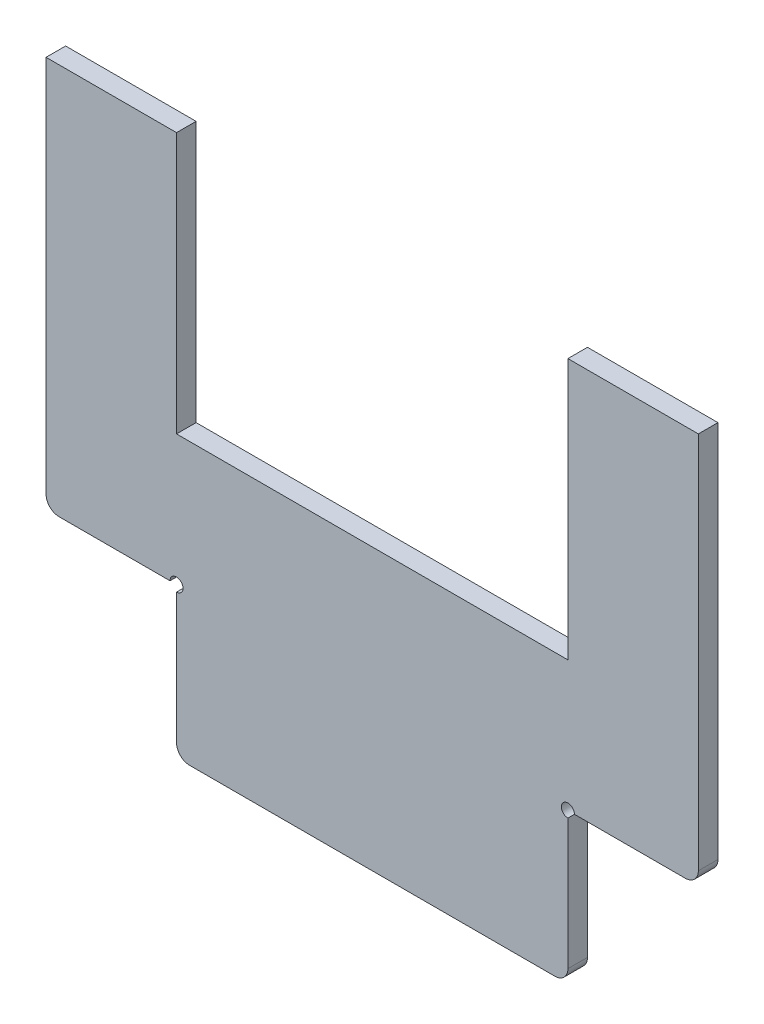
ISO-10303-21;
HEADER;
FILE_DESCRIPTION(('STEP AP214'),'2;1');
FILE_NAME('part.step','',(''),(''),'','','');
FILE_SCHEMA(('AUTOMOTIVE_DESIGN { 1 0 10303 214 1 1 1 1 }'));
ENDSEC;
DATA;
#1=APPLICATION_CONTEXT('core data for automotive mechanical design processes');
#2=APPLICATION_PROTOCOL_DEFINITION('international standard','automotive_design',2000,#1);
#3=PRODUCT_CONTEXT('',#1,'mechanical');
#4=PRODUCT('Part','Part','',(#3));
#5=PRODUCT_RELATED_PRODUCT_CATEGORY('part','',(#4));
#6=PRODUCT_DEFINITION_FORMATION('','',#4);
#7=PRODUCT_DEFINITION_CONTEXT('part definition',#1,'design');
#8=PRODUCT_DEFINITION('design','',#6,#7);
#9=PRODUCT_DEFINITION_SHAPE('','',#8);
#10=(LENGTH_UNIT() NAMED_UNIT(*) SI_UNIT(.MILLI.,.METRE.));
#11=(NAMED_UNIT(*) PLANE_ANGLE_UNIT() SI_UNIT($,.RADIAN.));
#12=(NAMED_UNIT(*) SI_UNIT($,.STERADIAN.) SOLID_ANGLE_UNIT());
#13=UNCERTAINTY_MEASURE_WITH_UNIT(LENGTH_MEASURE(1.E-05),#10,'distance_accuracy_value','');
#14=(GEOMETRIC_REPRESENTATION_CONTEXT(3) GLOBAL_UNCERTAINTY_ASSIGNED_CONTEXT((#13)) GLOBAL_UNIT_ASSIGNED_CONTEXT((#10,
#11,#12)) REPRESENTATION_CONTEXT('',''));
#15=CARTESIAN_POINT('',(0.,0.,0.));
#16=DIRECTION('',(0.,0.,1.));
#17=DIRECTION('',(1.,0.,0.));
#18=AXIS2_PLACEMENT_3D('',#15,#16,#17);
#19=CARTESIAN_POINT('',(30.,-11.5,3.));
#20=DIRECTION('',(-1.,0.,0.));
#21=DIRECTION('',(0.,0.,1.));
#22=AXIS2_PLACEMENT_3D('',#19,#20,#21);
#23=PLANE('',#22);
#24=DIRECTION('',(0.,1.,0.));
#25=VECTOR('',#24,1.);
#26=CARTESIAN_POINT('',(30.,-11.5,3.));
#27=LINE('',#26,#25);
#28=CARTESIAN_POINT('',(30.,-9.5,3.));
#29=VERTEX_POINT('',#28);
#30=CARTESIAN_POINT('',(30.,10.5,3.));
#31=VERTEX_POINT('',#30);
#32=EDGE_CURVE('E177',#29,#31,#27,.T.);
#33=ORIENTED_EDGE('',*,*,#32,.F.);
#34=DIRECTION('',(0.,0.,-1.));
#35=VECTOR('',#34,1.);
#36=CARTESIAN_POINT('',(30.,-9.5,3.));
#37=LINE('',#36,#35);
#38=CARTESIAN_POINT('',(30.,-9.5,0.));
#39=VERTEX_POINT('',#38);
#40=EDGE_CURVE('E265',#29,#39,#37,.T.);
#41=ORIENTED_EDGE('',*,*,#40,.T.);
#42=DIRECTION('',(0.,1.,0.));
#43=VECTOR('',#42,1.);
#44=CARTESIAN_POINT('',(30.,-11.5,0.));
#45=LINE('',#44,#43);
#46=CARTESIAN_POINT('',(30.,10.5,0.));
#47=VERTEX_POINT('',#46);
#48=EDGE_CURVE('E200',#39,#47,#45,.T.);
#49=ORIENTED_EDGE('',*,*,#48,.T.);
#50=DIRECTION('',(0.,0.,1.));
#51=VECTOR('',#50,1.);
#52=CARTESIAN_POINT('',(30.,10.5,0.));
#53=LINE('',#52,#51);
#54=EDGE_CURVE('E290',#47,#31,#53,.T.);
#55=ORIENTED_EDGE('',*,*,#54,.T.);
#56=EDGE_LOOP('',(#33,#41,#49,#55));
#57=FACE_BOUND('',#56,.T.);
#58=ADVANCED_FACE('F33',(#57),#23,.F.);
#59=CARTESIAN_POINT('',(-30.,-11.5,3.));
#60=DIRECTION('',(1.,0.,0.));
#61=DIRECTION('',(0.,0.,-1.));
#62=AXIS2_PLACEMENT_3D('',#59,#60,#61);
#63=PLANE('',#62);
#64=DIRECTION('',(0.,-1.,0.));
#65=VECTOR('',#64,1.);
#66=CARTESIAN_POINT('',(-30.,-11.5,0.));
#67=LINE('',#66,#65);
#68=CARTESIAN_POINT('',(-30.,10.5,0.));
#69=VERTEX_POINT('',#68);
#70=CARTESIAN_POINT('',(-30.,-9.5,0.));
#71=VERTEX_POINT('',#70);
#72=EDGE_CURVE('E238',#69,#71,#67,.T.);
#73=ORIENTED_EDGE('',*,*,#72,.T.);
#74=DIRECTION('',(0.,0.,-1.));
#75=VECTOR('',#74,1.);
#76=CARTESIAN_POINT('',(-30.,-9.5,3.));
#77=LINE('',#76,#75);
#78=CARTESIAN_POINT('',(-30.,-9.5,3.));
#79=VERTEX_POINT('',#78);
#80=EDGE_CURVE('E11',#71,#79,#77,.F.);
#81=ORIENTED_EDGE('',*,*,#80,.T.);
#82=DIRECTION('',(0.,-1.,0.));
#83=VECTOR('',#82,1.);
#84=CARTESIAN_POINT('',(-30.,-11.5,3.));
#85=LINE('',#84,#83);
#86=CARTESIAN_POINT('',(-30.,10.5,3.));
#87=VERTEX_POINT('',#86);
#88=EDGE_CURVE('E231',#87,#79,#85,.T.);
#89=ORIENTED_EDGE('',*,*,#88,.F.);
#90=DIRECTION('',(0.,0.,1.));
#91=VECTOR('',#90,1.);
#92=CARTESIAN_POINT('',(-30.,10.5,0.));
#93=LINE('',#92,#91);
#94=EDGE_CURVE('E188',#87,#69,#93,.F.);
#95=ORIENTED_EDGE('',*,*,#94,.T.);
#96=EDGE_LOOP('',(#73,#81,#89,#95));
#97=FACE_BOUND('',#96,.T.);
#98=ADVANCED_FACE('F352',(#97),#63,.F.);
#99=CARTESIAN_POINT('',(-30.,-11.5,3.));
#100=DIRECTION('',(0.,1.,0.));
#101=DIRECTION('',(0.,0.,1.));
#102=AXIS2_PLACEMENT_3D('',#99,#100,#101);
#103=PLANE('',#102);
#104=DIRECTION('',(1.,0.,0.));
#105=VECTOR('',#104,1.);
#106=CARTESIAN_POINT('',(-30.,-11.5,0.));
#107=LINE('',#106,#105);
#108=CARTESIAN_POINT('',(-28.,-11.5,0.));
#109=VERTEX_POINT('',#108);
#110=CARTESIAN_POINT('',(28.,-11.5,0.));
#111=VERTEX_POINT('',#110);
#112=EDGE_CURVE('E232',#109,#111,#107,.T.);
#113=ORIENTED_EDGE('',*,*,#112,.T.);
#114=DIRECTION('',(0.,0.,-1.));
#115=VECTOR('',#114,1.);
#116=CARTESIAN_POINT('',(28.,-11.5,3.));
#117=LINE('',#116,#115);
#118=CARTESIAN_POINT('',(28.,-11.5,3.));
#119=VERTEX_POINT('',#118);
#120=EDGE_CURVE('E41',#111,#119,#117,.F.);
#121=ORIENTED_EDGE('',*,*,#120,.T.);
#122=DIRECTION('',(1.,0.,0.));
#123=VECTOR('',#122,1.);
#124=CARTESIAN_POINT('',(-30.,-11.5,3.));
#125=LINE('',#124,#123);
#126=CARTESIAN_POINT('',(-28.,-11.5,3.));
#127=VERTEX_POINT('',#126);
#128=EDGE_CURVE('E170',#127,#119,#125,.T.);
#129=ORIENTED_EDGE('',*,*,#128,.F.);
#130=DIRECTION('',(0.,0.,-1.));
#131=VECTOR('',#130,1.);
#132=CARTESIAN_POINT('',(-28.,-11.5,3.));
#133=LINE('',#132,#131);
#134=EDGE_CURVE('E268',#127,#109,#133,.T.);
#135=ORIENTED_EDGE('',*,*,#134,.T.);
#136=EDGE_LOOP('',(#113,#121,#129,#135));
#137=FACE_BOUND('',#136,.T.);
#138=ADVANCED_FACE('F273',(#137),#103,.F.);
#139=CARTESIAN_POINT('',(0.,0.,3.));
#140=DIRECTION('',(0.,0.,-1.));
#141=DIRECTION('',(-1.,0.,0.));
#142=AXIS2_PLACEMENT_3D('',#139,#140,#141);
#143=PLANE('',#142);
#144=DIRECTION('',(1.,0.,0.));
#145=VECTOR('',#144,1.);
#146=CARTESIAN_POINT('',(50.,11.5,3.));
#147=LINE('',#146,#145);
#148=CARTESIAN_POINT('',(31.,11.5,3.));
#149=VERTEX_POINT('',#148);
#150=CARTESIAN_POINT('',(48.,11.5,3.));
#151=VERTEX_POINT('',#150);
#152=EDGE_CURVE('E175',#149,#151,#147,.T.);
#153=ORIENTED_EDGE('',*,*,#152,.T.);
#154=CARTESIAN_POINT('',(48.,13.5,3.));
#155=DIRECTION('',(0.,0.,-1.));
#156=DIRECTION('',(-1.,0.,0.));
#157=AXIS2_PLACEMENT_3D('',#154,#155,#156);
#158=CIRCLE('',#157,2.);
#159=CARTESIAN_POINT('',(50.,13.5,3.));
#160=VERTEX_POINT('',#159);
#161=EDGE_CURVE('E250',#151,#160,#158,.F.);
#162=ORIENTED_EDGE('',*,*,#161,.T.);
#163=DIRECTION('',(0.,1.,0.));
#164=VECTOR('',#163,1.);
#165=CARTESIAN_POINT('',(50.,11.5,3.));
#166=LINE('',#165,#164);
#167=CARTESIAN_POINT('',(50.,71.5,3.));
#168=VERTEX_POINT('',#167);
#169=EDGE_CURVE('E186',#160,#168,#166,.T.);
#170=ORIENTED_EDGE('',*,*,#169,.T.);
#171=DIRECTION('',(-1.,0.,0.));
#172=VECTOR('',#171,1.);
#173=CARTESIAN_POINT('',(50.,71.5,3.));
#174=LINE('',#173,#172);
#175=CARTESIAN_POINT('',(30.,71.5,3.));
#176=VERTEX_POINT('',#175);
#177=EDGE_CURVE('E305',#168,#176,#174,.T.);
#178=ORIENTED_EDGE('',*,*,#177,.T.);
#179=DIRECTION('',(0.,-1.,0.));
#180=VECTOR('',#179,1.);
#181=CARTESIAN_POINT('',(30.,31.5,3.));
#182=LINE('',#181,#180);
#183=CARTESIAN_POINT('',(30.,31.5,3.));
#184=VERTEX_POINT('',#183);
#185=EDGE_CURVE('E303',#176,#184,#182,.T.);
#186=ORIENTED_EDGE('',*,*,#185,.T.);
#187=DIRECTION('',(-1.,0.,0.));
#188=VECTOR('',#187,1.);
#189=CARTESIAN_POINT('',(30.,31.5,3.));
#190=LINE('',#189,#188);
#191=CARTESIAN_POINT('',(-30.,31.5,3.));
#192=VERTEX_POINT('',#191);
#193=EDGE_CURVE('E300',#184,#192,#190,.T.);
#194=ORIENTED_EDGE('',*,*,#193,.T.);
#195=DIRECTION('',(0.,1.,0.));
#196=VECTOR('',#195,1.);
#197=CARTESIAN_POINT('',(-30.,31.5,3.));
#198=LINE('',#197,#196);
#199=CARTESIAN_POINT('',(-30.,71.5,3.));
#200=VERTEX_POINT('',#199);
#201=EDGE_CURVE('E297',#192,#200,#198,.T.);
#202=ORIENTED_EDGE('',*,*,#201,.T.);
#203=DIRECTION('',(-1.,0.,0.));
#204=VECTOR('',#203,1.);
#205=CARTESIAN_POINT('',(-50.,71.5,3.));
#206=LINE('',#205,#204);
#207=CARTESIAN_POINT('',(-50.,71.5,3.));
#208=VERTEX_POINT('',#207);
#209=EDGE_CURVE('E294',#200,#208,#206,.T.);
#210=ORIENTED_EDGE('',*,*,#209,.T.);
#211=DIRECTION('',(0.,-1.,0.));
#212=VECTOR('',#211,1.);
#213=CARTESIAN_POINT('',(-50.,11.5,3.));
#214=LINE('',#213,#212);
#215=CARTESIAN_POINT('',(-50.,13.5,3.));
#216=VERTEX_POINT('',#215);
#217=EDGE_CURVE('E184',#208,#216,#214,.T.);
#218=ORIENTED_EDGE('',*,*,#217,.T.);
#219=CARTESIAN_POINT('',(-48.,13.5,3.));
#220=DIRECTION('',(0.,0.,-1.));
#221=DIRECTION('',(-1.,0.,0.));
#222=AXIS2_PLACEMENT_3D('',#219,#220,#221);
#223=CIRCLE('',#222,2.);
#224=CARTESIAN_POINT('',(-48.,11.5,3.));
#225=VERTEX_POINT('',#224);
#226=EDGE_CURVE('E248',#216,#225,#223,.F.);
#227=ORIENTED_EDGE('',*,*,#226,.T.);
#228=CARTESIAN_POINT('',(-31.,11.5,3.));
#229=VERTEX_POINT('',#228);
#230=EDGE_CURVE('E183',#225,#229,#147,.T.);
#231=ORIENTED_EDGE('',*,*,#230,.T.);
#232=CARTESIAN_POINT('',(-30.,11.5,3.));
#233=DIRECTION('',(0.,0.,1.));
#234=DIRECTION('',(1.,0.,0.));
#235=AXIS2_PLACEMENT_3D('',#232,#233,#234);
#236=CIRCLE('',#235,1.);
#237=EDGE_CURVE('E283',#87,#229,#236,.T.);
#238=ORIENTED_EDGE('',*,*,#237,.F.);
#239=ORIENTED_EDGE('',*,*,#88,.T.);
#240=CARTESIAN_POINT('',(-28.,-9.5,3.));
#241=DIRECTION('',(0.,0.,-1.));
#242=DIRECTION('',(-1.,0.,0.));
#243=AXIS2_PLACEMENT_3D('',#240,#241,#242);
#244=CIRCLE('',#243,2.);
#245=EDGE_CURVE('E244',#79,#127,#244,.F.);
#246=ORIENTED_EDGE('',*,*,#245,.T.);
#247=ORIENTED_EDGE('',*,*,#128,.T.);
#248=CARTESIAN_POINT('',(28.,-9.5,3.));
#249=DIRECTION('',(0.,0.,-1.));
#250=DIRECTION('',(-1.,0.,0.));
#251=AXIS2_PLACEMENT_3D('',#248,#249,#250);
#252=CIRCLE('',#251,2.);
#253=EDGE_CURVE('E246',#119,#29,#252,.F.);
#254=ORIENTED_EDGE('',*,*,#253,.T.);
#255=ORIENTED_EDGE('',*,*,#32,.T.);
#256=CARTESIAN_POINT('',(30.,11.5,3.));
#257=DIRECTION('',(0.,0.,1.));
#258=DIRECTION('',(1.,0.,0.));
#259=AXIS2_PLACEMENT_3D('',#256,#257,#258);
#260=CIRCLE('',#259,1.);
#261=EDGE_CURVE('E161',#149,#31,#260,.T.);
#262=ORIENTED_EDGE('',*,*,#261,.F.);
#263=EDGE_LOOP('',(#153,#162,#170,#178,#186,#194,#202,#210,#218,#227,#231,#238,#239,#246,#247,
#254,#255,#262));
#264=FACE_BOUND('',#263,.T.);
#265=ADVANCED_FACE('F174',(#264),#143,.F.);
#266=CARTESIAN_POINT('',(0.,0.,0.));
#267=DIRECTION('',(0.,0.,-1.));
#268=DIRECTION('',(-1.,0.,0.));
#269=AXIS2_PLACEMENT_3D('',#266,#267,#268);
#270=PLANE('',#269);
#271=DIRECTION('',(0.,1.,0.));
#272=VECTOR('',#271,1.);
#273=CARTESIAN_POINT('',(50.,11.5,0.));
#274=LINE('',#273,#272);
#275=CARTESIAN_POINT('',(50.,13.5,0.));
#276=VERTEX_POINT('',#275);
#277=CARTESIAN_POINT('',(50.,71.5,0.));
#278=VERTEX_POINT('',#277);
#279=EDGE_CURVE('E195',#276,#278,#274,.T.);
#280=ORIENTED_EDGE('',*,*,#279,.F.);
#281=CARTESIAN_POINT('',(48.,13.5,0.));
#282=DIRECTION('',(0.,0.,-1.));
#283=DIRECTION('',(-1.,0.,0.));
#284=AXIS2_PLACEMENT_3D('',#281,#282,#283);
#285=CIRCLE('',#284,2.);
#286=CARTESIAN_POINT('',(48.,11.5,0.));
#287=VERTEX_POINT('',#286);
#288=EDGE_CURVE('E258',#276,#287,#285,.T.);
#289=ORIENTED_EDGE('',*,*,#288,.T.);
#290=DIRECTION('',(1.,0.,0.));
#291=VECTOR('',#290,1.);
#292=CARTESIAN_POINT('',(50.,11.5,0.));
#293=LINE('',#292,#291);
#294=CARTESIAN_POINT('',(31.,11.5,0.));
#295=VERTEX_POINT('',#294);
#296=EDGE_CURVE('E196',#295,#287,#293,.T.);
#297=ORIENTED_EDGE('',*,*,#296,.F.);
#298=CARTESIAN_POINT('',(30.,11.5,0.));
#299=DIRECTION('',(0.,0.,1.));
#300=DIRECTION('',(1.,0.,0.));
#301=AXIS2_PLACEMENT_3D('',#298,#299,#300);
#302=CIRCLE('',#301,1.);
#303=EDGE_CURVE('E164',#295,#47,#302,.T.);
#304=ORIENTED_EDGE('',*,*,#303,.T.);
#305=ORIENTED_EDGE('',*,*,#48,.F.);
#306=CARTESIAN_POINT('',(28.,-9.5,0.));
#307=DIRECTION('',(0.,0.,-1.));
#308=DIRECTION('',(-1.,0.,0.));
#309=AXIS2_PLACEMENT_3D('',#306,#307,#308);
#310=CIRCLE('',#309,2.);
#311=EDGE_CURVE('E54',#39,#111,#310,.T.);
#312=ORIENTED_EDGE('',*,*,#311,.T.);
#313=ORIENTED_EDGE('',*,*,#112,.F.);
#314=CARTESIAN_POINT('',(-28.,-9.5,0.));
#315=DIRECTION('',(0.,0.,-1.));
#316=DIRECTION('',(-1.,0.,0.));
#317=AXIS2_PLACEMENT_3D('',#314,#315,#316);
#318=CIRCLE('',#317,2.);
#319=EDGE_CURVE('E48',#109,#71,#318,.T.);
#320=ORIENTED_EDGE('',*,*,#319,.T.);
#321=ORIENTED_EDGE('',*,*,#72,.F.);
#322=CARTESIAN_POINT('',(-30.,11.5,0.));
#323=DIRECTION('',(0.,0.,1.));
#324=DIRECTION('',(1.,0.,0.));
#325=AXIS2_PLACEMENT_3D('',#322,#323,#324);
#326=CIRCLE('',#325,1.);
#327=CARTESIAN_POINT('',(-31.,11.5,0.));
#328=VERTEX_POINT('',#327);
#329=EDGE_CURVE('E286',#69,#328,#326,.T.);
#330=ORIENTED_EDGE('',*,*,#329,.T.);
#331=CARTESIAN_POINT('',(-48.,11.5,0.));
#332=VERTEX_POINT('',#331);
#333=EDGE_CURVE('E193',#332,#328,#293,.T.);
#334=ORIENTED_EDGE('',*,*,#333,.F.);
#335=CARTESIAN_POINT('',(-48.,13.5,0.));
#336=DIRECTION('',(0.,0.,-1.));
#337=DIRECTION('',(-1.,0.,0.));
#338=AXIS2_PLACEMENT_3D('',#335,#336,#337);
#339=CIRCLE('',#338,2.);
#340=CARTESIAN_POINT('',(-50.,13.5,0.));
#341=VERTEX_POINT('',#340);
#342=EDGE_CURVE('E256',#332,#341,#339,.T.);
#343=ORIENTED_EDGE('',*,*,#342,.T.);
#344=DIRECTION('',(0.,-1.,0.));
#345=VECTOR('',#344,1.);
#346=CARTESIAN_POINT('',(-50.,11.5,0.));
#347=LINE('',#346,#345);
#348=CARTESIAN_POINT('',(-50.,71.5,0.));
#349=VERTEX_POINT('',#348);
#350=EDGE_CURVE('E197',#349,#341,#347,.T.);
#351=ORIENTED_EDGE('',*,*,#350,.F.);
#352=DIRECTION('',(-1.,0.,0.));
#353=VECTOR('',#352,1.);
#354=CARTESIAN_POINT('',(-50.,71.5,0.));
#355=LINE('',#354,#353);
#356=CARTESIAN_POINT('',(-30.,71.5,0.));
#357=VERTEX_POINT('',#356);
#358=EDGE_CURVE('E202',#357,#349,#355,.T.);
#359=ORIENTED_EDGE('',*,*,#358,.F.);
#360=DIRECTION('',(0.,1.,0.));
#361=VECTOR('',#360,1.);
#362=CARTESIAN_POINT('',(-30.,31.5,0.));
#363=LINE('',#362,#361);
#364=CARTESIAN_POINT('',(-30.,31.5,0.));
#365=VERTEX_POINT('',#364);
#366=EDGE_CURVE('E206',#365,#357,#363,.T.);
#367=ORIENTED_EDGE('',*,*,#366,.F.);
#368=DIRECTION('',(-1.,0.,0.));
#369=VECTOR('',#368,1.);
#370=CARTESIAN_POINT('',(30.,31.5,0.));
#371=LINE('',#370,#369);
#372=CARTESIAN_POINT('',(30.,31.5,0.));
#373=VERTEX_POINT('',#372);
#374=EDGE_CURVE('E210',#373,#365,#371,.T.);
#375=ORIENTED_EDGE('',*,*,#374,.F.);
#376=DIRECTION('',(0.,-1.,0.));
#377=VECTOR('',#376,1.);
#378=CARTESIAN_POINT('',(30.,31.5,0.));
#379=LINE('',#378,#377);
#380=CARTESIAN_POINT('',(30.,71.5,0.));
#381=VERTEX_POINT('',#380);
#382=EDGE_CURVE('E214',#381,#373,#379,.T.);
#383=ORIENTED_EDGE('',*,*,#382,.F.);
#384=DIRECTION('',(-1.,0.,0.));
#385=VECTOR('',#384,1.);
#386=CARTESIAN_POINT('',(50.,71.5,0.));
#387=LINE('',#386,#385);
#388=EDGE_CURVE('E218',#278,#381,#387,.T.);
#389=ORIENTED_EDGE('',*,*,#388,.F.);
#390=EDGE_LOOP('',(#280,#289,#297,#304,#305,#312,#313,#320,#321,#330,#334,#343,#351,#359,#367,
#375,#383,#389));
#391=FACE_BOUND('',#390,.T.);
#392=ADVANCED_FACE('F282',(#391),#270,.T.);
#393=CARTESIAN_POINT('',(50.,11.5,-116.619037896906));
#394=DIRECTION('',(0.,-1.,0.));
#395=DIRECTION('',(0.,0.,-1.));
#396=AXIS2_PLACEMENT_3D('',#393,#394,#395);
#397=PLANE('',#396);
#398=ORIENTED_EDGE('',*,*,#230,.F.);
#399=DIRECTION('',(0.,0.,1.));
#400=VECTOR('',#399,1.);
#401=CARTESIAN_POINT('',(-48.,11.5,-116.619037896906));
#402=LINE('',#401,#400);
#403=EDGE_CURVE('E263',#225,#332,#402,.F.);
#404=ORIENTED_EDGE('',*,*,#403,.T.);
#405=ORIENTED_EDGE('',*,*,#333,.T.);
#406=DIRECTION('',(0.,0.,1.));
#407=VECTOR('',#406,1.);
#408=CARTESIAN_POINT('',(-31.,11.5,0.));
#409=LINE('',#408,#407);
#410=EDGE_CURVE('E169',#229,#328,#409,.F.);
#411=ORIENTED_EDGE('',*,*,#410,.F.);
#412=EDGE_LOOP('',(#398,#404,#405,#411));
#413=FACE_BOUND('',#412,.T.);
#414=ADVANCED_FACE('F344',(#413),#397,.T.);
#415=ORIENTED_EDGE('',*,*,#296,.T.);
#416=DIRECTION('',(0.,0.,1.));
#417=VECTOR('',#416,1.);
#418=CARTESIAN_POINT('',(48.,11.5,-116.619037896906));
#419=LINE('',#418,#417);
#420=EDGE_CURVE('E182',#287,#151,#419,.T.);
#421=ORIENTED_EDGE('',*,*,#420,.T.);
#422=ORIENTED_EDGE('',*,*,#152,.F.);
#423=DIRECTION('',(0.,0.,1.));
#424=VECTOR('',#423,1.);
#425=CARTESIAN_POINT('',(31.,11.5,0.));
#426=LINE('',#425,#424);
#427=EDGE_CURVE('E157',#295,#149,#426,.T.);
#428=ORIENTED_EDGE('',*,*,#427,.F.);
#429=EDGE_LOOP('',(#415,#421,#422,#428));
#430=FACE_BOUND('',#429,.T.);
#431=ADVANCED_FACE('F180',(#430),#397,.T.);
#432=CARTESIAN_POINT('',(50.,11.5,-116.619037896906));
#433=DIRECTION('',(1.,0.,0.));
#434=DIRECTION('',(0.,0.,-1.));
#435=AXIS2_PLACEMENT_3D('',#432,#433,#434);
#436=PLANE('',#435);
#437=ORIENTED_EDGE('',*,*,#169,.F.);
#438=DIRECTION('',(0.,0.,1.));
#439=VECTOR('',#438,1.);
#440=CARTESIAN_POINT('',(50.,13.5,-116.619037896906));
#441=LINE('',#440,#439);
#442=EDGE_CURVE('E252',#160,#276,#441,.F.);
#443=ORIENTED_EDGE('',*,*,#442,.T.);
#444=ORIENTED_EDGE('',*,*,#279,.T.);
#445=DIRECTION('',(0.,0.,1.));
#446=VECTOR('',#445,1.);
#447=CARTESIAN_POINT('',(50.,71.5,-116.619037896906));
#448=LINE('',#447,#446);
#449=EDGE_CURVE('E221',#278,#168,#448,.T.);
#450=ORIENTED_EDGE('',*,*,#449,.T.);
#451=EDGE_LOOP('',(#437,#443,#444,#450));
#452=FACE_BOUND('',#451,.T.);
#453=ADVANCED_FACE('F312',(#452),#436,.T.);
#454=CARTESIAN_POINT('',(50.,71.5,-116.619037896906));
#455=DIRECTION('',(0.,1.,0.));
#456=DIRECTION('',(-1.,0.,0.));
#457=AXIS2_PLACEMENT_3D('',#454,#455,#456);
#458=PLANE('',#457);
#459=ORIENTED_EDGE('',*,*,#449,.F.);
#460=ORIENTED_EDGE('',*,*,#388,.T.);
#461=DIRECTION('',(0.,0.,1.));
#462=VECTOR('',#461,1.);
#463=CARTESIAN_POINT('',(30.,71.5,-116.619037896906));
#464=LINE('',#463,#462);
#465=EDGE_CURVE('E217',#381,#176,#464,.T.);
#466=ORIENTED_EDGE('',*,*,#465,.T.);
#467=ORIENTED_EDGE('',*,*,#177,.F.);
#468=EDGE_LOOP('',(#459,#460,#466,#467));
#469=FACE_BOUND('',#468,.T.);
#470=ADVANCED_FACE('F315',(#469),#458,.T.);
#471=CARTESIAN_POINT('',(30.,31.5,-116.619037896906));
#472=DIRECTION('',(-1.,0.,0.));
#473=DIRECTION('',(0.,0.,1.));
#474=AXIS2_PLACEMENT_3D('',#471,#472,#473);
#475=PLANE('',#474);
#476=ORIENTED_EDGE('',*,*,#465,.F.);
#477=ORIENTED_EDGE('',*,*,#382,.T.);
#478=DIRECTION('',(0.,0.,1.));
#479=VECTOR('',#478,1.);
#480=CARTESIAN_POINT('',(30.,31.5,-116.619037896906));
#481=LINE('',#480,#479);
#482=EDGE_CURVE('E213',#373,#184,#481,.T.);
#483=ORIENTED_EDGE('',*,*,#482,.T.);
#484=ORIENTED_EDGE('',*,*,#185,.F.);
#485=EDGE_LOOP('',(#476,#477,#483,#484));
#486=FACE_BOUND('',#485,.T.);
#487=ADVANCED_FACE('F319',(#486),#475,.T.);
#488=CARTESIAN_POINT('',(30.,31.5,-116.619037896906));
#489=DIRECTION('',(0.,1.,0.));
#490=DIRECTION('',(0.,0.,1.));
#491=AXIS2_PLACEMENT_3D('',#488,#489,#490);
#492=PLANE('',#491);
#493=ORIENTED_EDGE('',*,*,#482,.F.);
#494=ORIENTED_EDGE('',*,*,#374,.T.);
#495=DIRECTION('',(0.,0.,1.));
#496=VECTOR('',#495,1.);
#497=CARTESIAN_POINT('',(-30.,31.5,-116.619037896906));
#498=LINE('',#497,#496);
#499=EDGE_CURVE('E209',#365,#192,#498,.T.);
#500=ORIENTED_EDGE('',*,*,#499,.T.);
#501=ORIENTED_EDGE('',*,*,#193,.F.);
#502=EDGE_LOOP('',(#493,#494,#500,#501));
#503=FACE_BOUND('',#502,.T.);
#504=ADVANCED_FACE('F325',(#503),#492,.T.);
#505=CARTESIAN_POINT('',(-30.,31.5,-116.619037896906));
#506=DIRECTION('',(1.,0.,0.));
#507=DIRECTION('',(0.,0.,-1.));
#508=AXIS2_PLACEMENT_3D('',#505,#506,#507);
#509=PLANE('',#508);
#510=ORIENTED_EDGE('',*,*,#499,.F.);
#511=ORIENTED_EDGE('',*,*,#366,.T.);
#512=DIRECTION('',(0.,0.,1.));
#513=VECTOR('',#512,1.);
#514=CARTESIAN_POINT('',(-30.,71.5,-116.619037896906));
#515=LINE('',#514,#513);
#516=EDGE_CURVE('E205',#357,#200,#515,.T.);
#517=ORIENTED_EDGE('',*,*,#516,.T.);
#518=ORIENTED_EDGE('',*,*,#201,.F.);
#519=EDGE_LOOP('',(#510,#511,#517,#518));
#520=FACE_BOUND('',#519,.T.);
#521=ADVANCED_FACE('F328',(#520),#509,.T.);
#522=CARTESIAN_POINT('',(-50.,71.5,-116.619037896906));
#523=DIRECTION('',(0.,1.,0.));
#524=DIRECTION('',(-1.,0.,0.));
#525=AXIS2_PLACEMENT_3D('',#522,#523,#524);
#526=PLANE('',#525);
#527=ORIENTED_EDGE('',*,*,#516,.F.);
#528=ORIENTED_EDGE('',*,*,#358,.T.);
#529=DIRECTION('',(0.,0.,1.));
#530=VECTOR('',#529,1.);
#531=CARTESIAN_POINT('',(-50.,71.5,-116.619037896906));
#532=LINE('',#531,#530);
#533=EDGE_CURVE('E201',#349,#208,#532,.T.);
#534=ORIENTED_EDGE('',*,*,#533,.T.);
#535=ORIENTED_EDGE('',*,*,#209,.F.);
#536=EDGE_LOOP('',(#527,#528,#534,#535));
#537=FACE_BOUND('',#536,.T.);
#538=ADVANCED_FACE('F331',(#537),#526,.T.);
#539=CARTESIAN_POINT('',(-50.,11.5,-116.619037896906));
#540=DIRECTION('',(-1.,0.,0.));
#541=DIRECTION('',(0.,0.,1.));
#542=AXIS2_PLACEMENT_3D('',#539,#540,#541);
#543=PLANE('',#542);
#544=ORIENTED_EDGE('',*,*,#350,.T.);
#545=DIRECTION('',(0.,0.,1.));
#546=VECTOR('',#545,1.);
#547=CARTESIAN_POINT('',(-50.,13.5,-116.619037896906));
#548=LINE('',#547,#546);
#549=EDGE_CURVE('E260',#341,#216,#548,.T.);
#550=ORIENTED_EDGE('',*,*,#549,.T.);
#551=ORIENTED_EDGE('',*,*,#217,.F.);
#552=ORIENTED_EDGE('',*,*,#533,.F.);
#553=EDGE_LOOP('',(#544,#550,#551,#552));
#554=FACE_BOUND('',#553,.T.);
#555=ADVANCED_FACE('F336',(#554),#543,.T.);
#556=CARTESIAN_POINT('',(30.,11.5,0.));
#557=DIRECTION('',(0.,0.,1.));
#558=DIRECTION('',(1.,0.,0.));
#559=AXIS2_PLACEMENT_3D('',#556,#557,#558);
#560=CYLINDRICAL_SURFACE('',#559,1.);
#561=ORIENTED_EDGE('',*,*,#303,.F.);
#562=ORIENTED_EDGE('',*,*,#427,.T.);
#563=ORIENTED_EDGE('',*,*,#261,.T.);
#564=ORIENTED_EDGE('',*,*,#54,.F.);
#565=EDGE_LOOP('',(#561,#562,#563,#564));
#566=FACE_BOUND('',#565,.T.);
#567=ADVANCED_FACE('F159',(#566),#560,.F.);
#568=CARTESIAN_POINT('',(-30.,11.5,0.));
#569=DIRECTION('',(0.,0.,1.));
#570=DIRECTION('',(1.,0.,0.));
#571=AXIS2_PLACEMENT_3D('',#568,#569,#570);
#572=CYLINDRICAL_SURFACE('',#571,1.);
#573=ORIENTED_EDGE('',*,*,#237,.T.);
#574=ORIENTED_EDGE('',*,*,#410,.T.);
#575=ORIENTED_EDGE('',*,*,#329,.F.);
#576=ORIENTED_EDGE('',*,*,#94,.F.);
#577=EDGE_LOOP('',(#573,#574,#575,#576));
#578=FACE_BOUND('',#577,.T.);
#579=ADVANCED_FACE('F348',(#578),#572,.F.);
#580=CARTESIAN_POINT('',(48.,13.5,-116.619037896906));
#581=DIRECTION('',(0.,0.,1.));
#582=DIRECTION('',(1.,0.,0.));
#583=AXIS2_PLACEMENT_3D('',#580,#581,#582);
#584=CYLINDRICAL_SURFACE('',#583,2.);
#585=ORIENTED_EDGE('',*,*,#288,.F.);
#586=ORIENTED_EDGE('',*,*,#442,.F.);
#587=ORIENTED_EDGE('',*,*,#161,.F.);
#588=ORIENTED_EDGE('',*,*,#420,.F.);
#589=EDGE_LOOP('',(#585,#586,#587,#588));
#590=FACE_BOUND('',#589,.T.);
#591=ADVANCED_FACE('F367',(#590),#584,.T.);
#592=CARTESIAN_POINT('',(-48.,13.5,-116.619037896906));
#593=DIRECTION('',(0.,0.,1.));
#594=DIRECTION('',(1.,0.,0.));
#595=AXIS2_PLACEMENT_3D('',#592,#593,#594);
#596=CYLINDRICAL_SURFACE('',#595,2.);
#597=ORIENTED_EDGE('',*,*,#342,.F.);
#598=ORIENTED_EDGE('',*,*,#403,.F.);
#599=ORIENTED_EDGE('',*,*,#226,.F.);
#600=ORIENTED_EDGE('',*,*,#549,.F.);
#601=EDGE_LOOP('',(#597,#598,#599,#600));
#602=FACE_BOUND('',#601,.T.);
#603=ADVANCED_FACE('F340',(#602),#596,.T.);
#604=CARTESIAN_POINT('',(28.,-9.5,3.));
#605=DIRECTION('',(0.,0.,-1.));
#606=DIRECTION('',(-1.,0.,0.));
#607=AXIS2_PLACEMENT_3D('',#604,#605,#606);
#608=CYLINDRICAL_SURFACE('',#607,2.);
#609=ORIENTED_EDGE('',*,*,#253,.F.);
#610=ORIENTED_EDGE('',*,*,#120,.F.);
#611=ORIENTED_EDGE('',*,*,#311,.F.);
#612=ORIENTED_EDGE('',*,*,#40,.F.);
#613=EDGE_LOOP('',(#609,#610,#611,#612));
#614=FACE_BOUND('',#613,.T.);
#615=ADVANCED_FACE('F279',(#614),#608,.T.);
#616=CARTESIAN_POINT('',(-28.,-9.5,3.));
#617=DIRECTION('',(0.,0.,-1.));
#618=DIRECTION('',(-1.,0.,0.));
#619=AXIS2_PLACEMENT_3D('',#616,#617,#618);
#620=CYLINDRICAL_SURFACE('',#619,2.);
#621=ORIENTED_EDGE('',*,*,#245,.F.);
#622=ORIENTED_EDGE('',*,*,#80,.F.);
#623=ORIENTED_EDGE('',*,*,#319,.F.);
#624=ORIENTED_EDGE('',*,*,#134,.F.);
#625=EDGE_LOOP('',(#621,#622,#623,#624));
#626=FACE_BOUND('',#625,.T.);
#627=ADVANCED_FACE('F35',(#626),#620,.T.);
#628=CLOSED_SHELL('',(#58,#98,#138,#265,#392,#414,#431,#453,#470,#487,#504,#521,#538,#555,#567,
#579,#591,#603,#615,#627));
#629=MANIFOLD_SOLID_BREP('B2',#628);
#630=ADVANCED_BREP_SHAPE_REPRESENTATION('',(#18,#629),#14);
#631=SHAPE_DEFINITION_REPRESENTATION(#9,#630);
ENDSEC;
END-ISO-10303-21;
